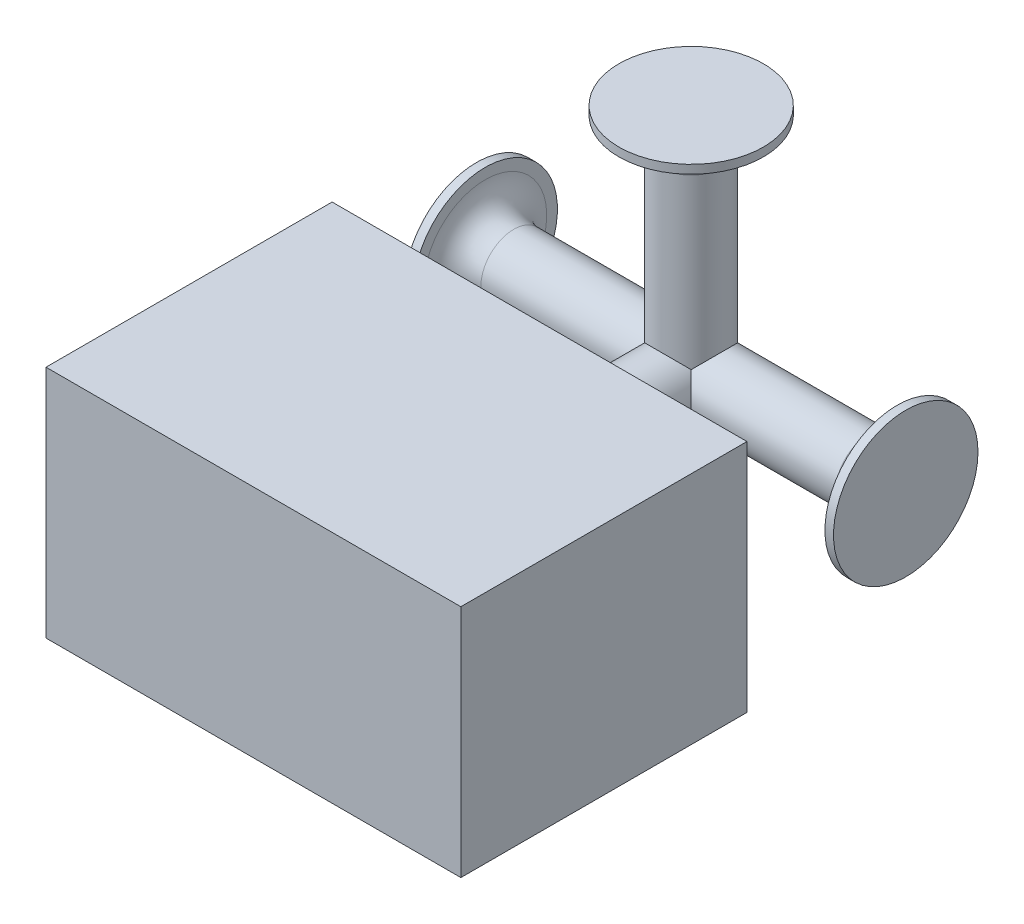
ISO-10303-21;
HEADER;
FILE_DESCRIPTION(('STEP AP214'),'2;1');
FILE_NAME('part.step','',(''),(''),'','','');
FILE_SCHEMA(('AUTOMOTIVE_DESIGN { 1 0 10303 214 1 1 1 1 }'));
ENDSEC;
DATA;
#1=APPLICATION_CONTEXT('core data for automotive mechanical design processes');
#2=APPLICATION_PROTOCOL_DEFINITION('international standard','automotive_design',2000,#1);
#3=PRODUCT_CONTEXT('',#1,'mechanical');
#4=PRODUCT('Part','Part','',(#3));
#5=PRODUCT_RELATED_PRODUCT_CATEGORY('part','',(#4));
#6=PRODUCT_DEFINITION_FORMATION('','',#4);
#7=PRODUCT_DEFINITION_CONTEXT('part definition',#1,'design');
#8=PRODUCT_DEFINITION('design','',#6,#7);
#9=PRODUCT_DEFINITION_SHAPE('','',#8);
#10=(LENGTH_UNIT() NAMED_UNIT(*) SI_UNIT(.MILLI.,.METRE.));
#11=(NAMED_UNIT(*) PLANE_ANGLE_UNIT() SI_UNIT($,.RADIAN.));
#12=(NAMED_UNIT(*) SI_UNIT($,.STERADIAN.) SOLID_ANGLE_UNIT());
#13=UNCERTAINTY_MEASURE_WITH_UNIT(LENGTH_MEASURE(1.E-05),#10,'distance_accuracy_value','');
#14=(GEOMETRIC_REPRESENTATION_CONTEXT(3) GLOBAL_UNCERTAINTY_ASSIGNED_CONTEXT((#13)) GLOBAL_UNIT_ASSIGNED_CONTEXT((#10,
#11,#12)) REPRESENTATION_CONTEXT('',''));
#15=CARTESIAN_POINT('',(0.,0.,0.));
#16=DIRECTION('',(0.,0.,1.));
#17=DIRECTION('',(1.,0.,0.));
#18=AXIS2_PLACEMENT_3D('',#15,#16,#17);
#19=CARTESIAN_POINT('',(0.,-80.,0.));
#20=DIRECTION('',(0.,1.,0.));
#21=DIRECTION('',(0.,0.,1.));
#22=AXIS2_PLACEMENT_3D('',#19,#20,#21);
#23=CYLINDRICAL_SURFACE('',#22,11.5);
#24=CARTESIAN_POINT('',(0.,-13.,0.));
#25=DIRECTION('',(0.,1.,0.));
#26=DIRECTION('',(0.,0.,1.));
#27=AXIS2_PLACEMENT_3D('',#24,#25,#26);
#28=CIRCLE('',#27,11.5);
#29=CARTESIAN_POINT('',(0.,-13.,11.5));
#30=VERTEX_POINT('',#29);
#31=EDGE_CURVE('E147',#30,#30,#28,.F.);
#32=ORIENTED_EDGE('',*,*,#31,.T.);
#33=EDGE_LOOP('',(#32));
#34=FACE_BOUND('',#33,.T.);
#35=CARTESIAN_POINT('',(0.,-80.,0.));
#36=DIRECTION('',(0.,0.707106781186547,-0.707106781186547));
#37=DIRECTION('',(0.,0.707106781186547,0.707106781186547));
#38=AXIS2_PLACEMENT_3D('',#35,#36,#37);
#39=ELLIPSE('',#38,16.2634559672906,11.5);
#40=CARTESIAN_POINT('',(8.13172798364529,-71.8682720163547,8.13172798364529));
#41=VERTEX_POINT('',#40);
#42=CARTESIAN_POINT('',(-8.13172798364529,-71.8682720163547,8.13172798364529));
#43=VERTEX_POINT('',#42);
#44=EDGE_CURVE('E108',#41,#43,#39,.F.);
#45=ORIENTED_EDGE('',*,*,#44,.F.);
#46=CARTESIAN_POINT('',(0.,-80.,0.));
#47=DIRECTION('',(-0.707106781186547,0.707106781186547,0.));
#48=DIRECTION('',(0.707106781186547,0.707106781186547,0.));
#49=AXIS2_PLACEMENT_3D('',#46,#47,#48);
#50=ELLIPSE('',#49,16.2634559672906,11.5);
#51=CARTESIAN_POINT('',(0.,-80.,-11.5));
#52=VERTEX_POINT('',#51);
#53=EDGE_CURVE('E130',#52,#41,#50,.F.);
#54=ORIENTED_EDGE('',*,*,#53,.F.);
#55=CARTESIAN_POINT('',(0.,-80.,0.));
#56=DIRECTION('',(0.707106781186547,0.707106781186547,0.));
#57=DIRECTION('',(-0.707106781186547,0.707106781186547,0.));
#58=AXIS2_PLACEMENT_3D('',#55,#56,#57);
#59=ELLIPSE('',#58,16.2634559672906,11.5);
#60=EDGE_CURVE('E126',#43,#52,#59,.F.);
#61=ORIENTED_EDGE('',*,*,#60,.F.);
#62=EDGE_LOOP('',(#45,#54,#61));
#63=FACE_BOUND('',#62,.T.);
#64=ADVANCED_FACE('F32',(#34,#63),#23,.T.);
#65=CARTESIAN_POINT('',(72.,-80.,0.));
#66=DIRECTION('',(-1.,0.,0.));
#67=DIRECTION('',(0.,0.,1.));
#68=AXIS2_PLACEMENT_3D('',#65,#66,#67);
#69=CYLINDRICAL_SURFACE('',#68,11.5);
#70=CARTESIAN_POINT('',(62.,-80.,0.));
#71=DIRECTION('',(1.,0.,0.));
#72=DIRECTION('',(0.,0.,-1.));
#73=AXIS2_PLACEMENT_3D('',#70,#71,#72);
#74=CIRCLE('',#73,11.5);
#75=CARTESIAN_POINT('',(62.,-80.,-11.5));
#76=VERTEX_POINT('',#75);
#77=EDGE_CURVE('E136',#76,#76,#74,.F.);
#78=ORIENTED_EDGE('',*,*,#77,.T.);
#79=EDGE_LOOP('',(#78));
#80=FACE_BOUND('',#79,.T.);
#81=CARTESIAN_POINT('',(-62.,-80.,0.));
#82=DIRECTION('',(-1.,0.,0.));
#83=DIRECTION('',(0.,0.,1.));
#84=AXIS2_PLACEMENT_3D('',#81,#82,#83);
#85=CIRCLE('',#84,11.5);
#86=CARTESIAN_POINT('',(-62.,-80.,11.5));
#87=VERTEX_POINT('',#86);
#88=EDGE_CURVE('E141',#87,#87,#85,.F.);
#89=ORIENTED_EDGE('',*,*,#88,.T.);
#90=EDGE_LOOP('',(#89));
#91=FACE_BOUND('',#90,.T.);
#92=CARTESIAN_POINT('',(0.,-80.,0.));
#93=DIRECTION('',(-0.707106781186547,0.,-0.707106781186547));
#94=DIRECTION('',(-0.707106781186547,0.,0.707106781186547));
#95=AXIS2_PLACEMENT_3D('',#92,#93,#94);
#96=ELLIPSE('',#95,16.2634559672906,11.5);
#97=CARTESIAN_POINT('',(0.,-91.5,0.));
#98=VERTEX_POINT('',#97);
#99=EDGE_CURVE('E11',#43,#98,#96,.F.);
#100=ORIENTED_EDGE('',*,*,#99,.F.);
#101=ORIENTED_EDGE('',*,*,#60,.T.);
#102=ORIENTED_EDGE('',*,*,#53,.T.);
#103=CARTESIAN_POINT('',(0.,-80.,0.));
#104=DIRECTION('',(-0.707106781186547,0.,0.707106781186547));
#105=DIRECTION('',(-0.707106781186547,0.,-0.707106781186547));
#106=AXIS2_PLACEMENT_3D('',#103,#104,#105);
#107=ELLIPSE('',#106,16.2634559672906,11.5);
#108=EDGE_CURVE('E40',#98,#41,#107,.T.);
#109=ORIENTED_EDGE('',*,*,#108,.F.);
#110=EDGE_LOOP('',(#100,#101,#102,#109));
#111=FACE_BOUND('',#110,.T.);
#112=ADVANCED_FACE('F160',(#80,#91,#111),#69,.T.);
#113=CARTESIAN_POINT('',(0.,-3.,0.));
#114=DIRECTION('',(0.,1.,0.));
#115=DIRECTION('',(0.,0.,1.));
#116=AXIS2_PLACEMENT_3D('',#113,#114,#115);
#117=CYLINDRICAL_SURFACE('',#116,25.25);
#118=CARTESIAN_POINT('',(0.,-3.,0.));
#119=DIRECTION('',(0.,1.,0.));
#120=DIRECTION('',(0.,0.,1.));
#121=AXIS2_PLACEMENT_3D('',#118,#119,#120);
#122=CIRCLE('',#121,25.25);
#123=CARTESIAN_POINT('',(0.,-3.,25.25));
#124=VERTEX_POINT('',#123);
#125=EDGE_CURVE('E133',#124,#124,#122,.T.);
#126=ORIENTED_EDGE('',*,*,#125,.T.);
#127=EDGE_LOOP('',(#126));
#128=FACE_BOUND('',#127,.T.);
#129=CARTESIAN_POINT('',(0.,0.,0.));
#130=DIRECTION('',(0.,1.,0.));
#131=DIRECTION('',(0.,0.,1.));
#132=AXIS2_PLACEMENT_3D('',#129,#130,#131);
#133=CIRCLE('',#132,25.25);
#134=CARTESIAN_POINT('',(0.,0.,25.25));
#135=VERTEX_POINT('',#134);
#136=EDGE_CURVE('E132',#135,#135,#133,.T.);
#137=ORIENTED_EDGE('',*,*,#136,.F.);
#138=EDGE_LOOP('',(#137));
#139=FACE_BOUND('',#138,.T.);
#140=ADVANCED_FACE('F162',(#128,#139),#117,.T.);
#141=CARTESIAN_POINT('',(0.,-3.,0.));
#142=DIRECTION('',(0.,1.,0.));
#143=DIRECTION('',(0.,0.,1.));
#144=AXIS2_PLACEMENT_3D('',#141,#142,#143);
#145=PLANE('',#144);
#146=CARTESIAN_POINT('',(0.,-3.,0.));
#147=DIRECTION('',(0.,1.,0.));
#148=DIRECTION('',(0.,0.,1.));
#149=AXIS2_PLACEMENT_3D('',#146,#147,#148);
#150=CIRCLE('',#149,21.5);
#151=CARTESIAN_POINT('',(0.,-3.,21.5));
#152=VERTEX_POINT('',#151);
#153=EDGE_CURVE('E150',#152,#152,#150,.T.);
#154=ORIENTED_EDGE('',*,*,#153,.T.);
#155=EDGE_LOOP('',(#154));
#156=FACE_BOUND('',#155,.T.);
#157=ORIENTED_EDGE('',*,*,#125,.F.);
#158=EDGE_LOOP('',(#157));
#159=FACE_BOUND('',#158,.T.);
#160=ADVANCED_FACE('F169',(#156,#159),#145,.F.);
#161=CARTESIAN_POINT('',(0.,0.,0.));
#162=DIRECTION('',(0.,1.,0.));
#163=DIRECTION('',(0.,0.,1.));
#164=AXIS2_PLACEMENT_3D('',#161,#162,#163);
#165=PLANE('',#164);
#166=ORIENTED_EDGE('',*,*,#136,.T.);
#167=EDGE_LOOP('',(#166));
#168=FACE_BOUND('',#167,.T.);
#169=ADVANCED_FACE('F181',(#168),#165,.T.);
#170=CARTESIAN_POINT('',(75.,-80.,0.));
#171=DIRECTION('',(-1.,0.,0.));
#172=DIRECTION('',(0.,0.,1.));
#173=AXIS2_PLACEMENT_3D('',#170,#171,#172);
#174=CYLINDRICAL_SURFACE('',#173,25.25);
#175=CARTESIAN_POINT('',(75.,-80.,0.));
#176=DIRECTION('',(1.,0.,0.));
#177=DIRECTION('',(0.,0.,-1.));
#178=AXIS2_PLACEMENT_3D('',#175,#176,#177);
#179=CIRCLE('',#178,25.25);
#180=CARTESIAN_POINT('',(75.,-80.,-25.25));
#181=VERTEX_POINT('',#180);
#182=EDGE_CURVE('E123',#181,#181,#179,.T.);
#183=ORIENTED_EDGE('',*,*,#182,.F.);
#184=EDGE_LOOP('',(#183));
#185=FACE_BOUND('',#184,.T.);
#186=CARTESIAN_POINT('',(72.,-80.,0.));
#187=DIRECTION('',(1.,0.,0.));
#188=DIRECTION('',(0.,0.,-1.));
#189=AXIS2_PLACEMENT_3D('',#186,#187,#188);
#190=CIRCLE('',#189,25.25);
#191=CARTESIAN_POINT('',(72.,-80.,-25.25));
#192=VERTEX_POINT('',#191);
#193=EDGE_CURVE('E120',#192,#192,#190,.T.);
#194=ORIENTED_EDGE('',*,*,#193,.T.);
#195=EDGE_LOOP('',(#194));
#196=FACE_BOUND('',#195,.T.);
#197=ADVANCED_FACE('F176',(#185,#196),#174,.T.);
#198=CARTESIAN_POINT('',(75.,-80.,0.));
#199=DIRECTION('',(1.,0.,0.));
#200=DIRECTION('',(0.,0.,-1.));
#201=AXIS2_PLACEMENT_3D('',#198,#199,#200);
#202=PLANE('',#201);
#203=ORIENTED_EDGE('',*,*,#182,.T.);
#204=EDGE_LOOP('',(#203));
#205=FACE_BOUND('',#204,.T.);
#206=ADVANCED_FACE('F217',(#205),#202,.T.);
#207=CARTESIAN_POINT('',(72.,-80.,0.));
#208=DIRECTION('',(1.,0.,0.));
#209=DIRECTION('',(0.,0.,-1.));
#210=AXIS2_PLACEMENT_3D('',#207,#208,#209);
#211=PLANE('',#210);
#212=CARTESIAN_POINT('',(72.,-80.,0.));
#213=DIRECTION('',(1.,0.,0.));
#214=DIRECTION('',(0.,0.,-1.));
#215=AXIS2_PLACEMENT_3D('',#212,#213,#214);
#216=CIRCLE('',#215,21.5);
#217=CARTESIAN_POINT('',(72.,-80.,-21.5));
#218=VERTEX_POINT('',#217);
#219=EDGE_CURVE('E153',#218,#218,#216,.T.);
#220=ORIENTED_EDGE('',*,*,#219,.T.);
#221=EDGE_LOOP('',(#220));
#222=FACE_BOUND('',#221,.T.);
#223=ORIENTED_EDGE('',*,*,#193,.F.);
#224=EDGE_LOOP('',(#223));
#225=FACE_BOUND('',#224,.T.);
#226=ADVANCED_FACE('F213',(#222,#225),#211,.F.);
#227=CARTESIAN_POINT('',(-75.,-80.,0.));
#228=DIRECTION('',(1.,0.,0.));
#229=DIRECTION('',(0.,0.,-1.));
#230=AXIS2_PLACEMENT_3D('',#227,#228,#229);
#231=CYLINDRICAL_SURFACE('',#230,25.25);
#232=CARTESIAN_POINT('',(-75.,-80.,0.));
#233=DIRECTION('',(-1.,0.,0.));
#234=DIRECTION('',(0.,0.,1.));
#235=AXIS2_PLACEMENT_3D('',#232,#233,#234);
#236=CIRCLE('',#235,25.25);
#237=CARTESIAN_POINT('',(-75.,-80.,25.25));
#238=VERTEX_POINT('',#237);
#239=EDGE_CURVE('E117',#238,#238,#236,.T.);
#240=ORIENTED_EDGE('',*,*,#239,.F.);
#241=EDGE_LOOP('',(#240));
#242=FACE_BOUND('',#241,.T.);
#243=CARTESIAN_POINT('',(-72.,-80.,0.));
#244=DIRECTION('',(-1.,0.,0.));
#245=DIRECTION('',(0.,0.,1.));
#246=AXIS2_PLACEMENT_3D('',#243,#244,#245);
#247=CIRCLE('',#246,25.25);
#248=CARTESIAN_POINT('',(-72.,-80.,25.25));
#249=VERTEX_POINT('',#248);
#250=EDGE_CURVE('E116',#249,#249,#247,.T.);
#251=ORIENTED_EDGE('',*,*,#250,.T.);
#252=EDGE_LOOP('',(#251));
#253=FACE_BOUND('',#252,.T.);
#254=ADVANCED_FACE('F216',(#242,#253),#231,.T.);
#255=CARTESIAN_POINT('',(-75.,-80.,0.));
#256=DIRECTION('',(-1.,0.,0.));
#257=DIRECTION('',(0.,0.,1.));
#258=AXIS2_PLACEMENT_3D('',#255,#256,#257);
#259=PLANE('',#258);
#260=ORIENTED_EDGE('',*,*,#239,.T.);
#261=EDGE_LOOP('',(#260));
#262=FACE_BOUND('',#261,.T.);
#263=ADVANCED_FACE('F233',(#262),#259,.T.);
#264=CARTESIAN_POINT('',(-72.,-80.,0.));
#265=DIRECTION('',(-1.,0.,0.));
#266=DIRECTION('',(0.,0.,1.));
#267=AXIS2_PLACEMENT_3D('',#264,#265,#266);
#268=PLANE('',#267);
#269=CARTESIAN_POINT('',(-72.,-80.,0.));
#270=DIRECTION('',(-1.,0.,0.));
#271=DIRECTION('',(0.,0.,1.));
#272=AXIS2_PLACEMENT_3D('',#269,#270,#271);
#273=CIRCLE('',#272,21.5);
#274=CARTESIAN_POINT('',(-72.,-80.,21.5));
#275=VERTEX_POINT('',#274);
#276=EDGE_CURVE('E144',#275,#275,#273,.T.);
#277=ORIENTED_EDGE('',*,*,#276,.T.);
#278=EDGE_LOOP('',(#277));
#279=FACE_BOUND('',#278,.T.);
#280=ORIENTED_EDGE('',*,*,#250,.F.);
#281=EDGE_LOOP('',(#280));
#282=FACE_BOUND('',#281,.T.);
#283=ADVANCED_FACE('F189',(#279,#282),#268,.F.);
#284=CARTESIAN_POINT('',(-62.,-80.,0.));
#285=DIRECTION('',(-1.,0.,0.));
#286=DIRECTION('',(0.,0.,1.));
#287=AXIS2_PLACEMENT_3D('',#284,#285,#286);
#288=TOROIDAL_SURFACE('',#287,21.5,10.);
#289=ORIENTED_EDGE('',*,*,#276,.F.);
#290=EDGE_LOOP('',(#289));
#291=FACE_BOUND('',#290,.T.);
#292=ORIENTED_EDGE('',*,*,#88,.F.);
#293=EDGE_LOOP('',(#292));
#294=FACE_BOUND('',#293,.T.);
#295=ADVANCED_FACE('F186',(#291,#294),#288,.F.);
#296=CARTESIAN_POINT('',(0.,-13.,0.));
#297=DIRECTION('',(0.,1.,0.));
#298=DIRECTION('',(0.,0.,1.));
#299=AXIS2_PLACEMENT_3D('',#296,#297,#298);
#300=TOROIDAL_SURFACE('',#299,21.5,10.);
#301=ORIENTED_EDGE('',*,*,#153,.F.);
#302=EDGE_LOOP('',(#301));
#303=FACE_BOUND('',#302,.T.);
#304=ORIENTED_EDGE('',*,*,#31,.F.);
#305=EDGE_LOOP('',(#304));
#306=FACE_BOUND('',#305,.T.);
#307=ADVANCED_FACE('F188',(#303,#306),#300,.F.);
#308=CARTESIAN_POINT('',(62.,-80.,0.));
#309=DIRECTION('',(1.,0.,0.));
#310=DIRECTION('',(0.,0.,-1.));
#311=AXIS2_PLACEMENT_3D('',#308,#309,#310);
#312=TOROIDAL_SURFACE('',#311,21.5,10.);
#313=ORIENTED_EDGE('',*,*,#77,.F.);
#314=EDGE_LOOP('',(#313));
#315=FACE_BOUND('',#314,.T.);
#316=ORIENTED_EDGE('',*,*,#219,.F.);
#317=EDGE_LOOP('',(#316));
#318=FACE_BOUND('',#317,.T.);
#319=ADVANCED_FACE('F34',(#315,#318),#312,.F.);
#320=CARTESIAN_POINT('',(0.,-80.,53.));
#321=DIRECTION('',(0.,0.,-1.));
#322=DIRECTION('',(-1.,0.,0.));
#323=AXIS2_PLACEMENT_3D('',#320,#321,#322);
#324=CYLINDRICAL_SURFACE('',#323,11.5);
#325=CARTESIAN_POINT('',(0.,-80.,53.));
#326=DIRECTION('',(0.,0.,1.));
#327=DIRECTION('',(1.,0.,0.));
#328=AXIS2_PLACEMENT_3D('',#325,#326,#327);
#329=CIRCLE('',#328,11.5);
#330=CARTESIAN_POINT('',(11.5,-80.,53.));
#331=VERTEX_POINT('',#330);
#332=EDGE_CURVE('E105',#331,#331,#329,.T.);
#333=ORIENTED_EDGE('',*,*,#332,.F.);
#334=EDGE_LOOP('',(#333));
#335=FACE_BOUND('',#334,.T.);
#336=ORIENTED_EDGE('',*,*,#108,.T.);
#337=ORIENTED_EDGE('',*,*,#44,.T.);
#338=ORIENTED_EDGE('',*,*,#99,.T.);
#339=EDGE_LOOP('',(#336,#337,#338));
#340=FACE_BOUND('',#339,.T.);
#341=ADVANCED_FACE('F156',(#335,#340),#324,.T.);
#342=CARTESIAN_POINT('',(72.5,-39.,153.));
#343=DIRECTION('',(-1.,0.,0.));
#344=DIRECTION('',(0.,0.,1.));
#345=AXIS2_PLACEMENT_3D('',#342,#343,#344);
#346=PLANE('',#345);
#347=DIRECTION('',(0.,0.,-1.));
#348=VECTOR('',#347,1.);
#349=CARTESIAN_POINT('',(72.5,-121.,153.));
#350=LINE('',#349,#348);
#351=CARTESIAN_POINT('',(72.5,-121.,153.));
#352=VERTEX_POINT('',#351);
#353=CARTESIAN_POINT('',(72.5,-121.,53.));
#354=VERTEX_POINT('',#353);
#355=EDGE_CURVE('E104',#352,#354,#350,.T.);
#356=ORIENTED_EDGE('',*,*,#355,.T.);
#357=DIRECTION('',(0.,-1.,0.));
#358=VECTOR('',#357,1.);
#359=CARTESIAN_POINT('',(72.5,-39.,53.));
#360=LINE('',#359,#358);
#361=CARTESIAN_POINT('',(72.5,-39.,53.));
#362=VERTEX_POINT('',#361);
#363=EDGE_CURVE('E84',#362,#354,#360,.T.);
#364=ORIENTED_EDGE('',*,*,#363,.F.);
#365=DIRECTION('',(0.,0.,-1.));
#366=VECTOR('',#365,1.);
#367=CARTESIAN_POINT('',(72.5,-39.,153.));
#368=LINE('',#367,#366);
#369=CARTESIAN_POINT('',(72.5,-39.,153.));
#370=VERTEX_POINT('',#369);
#371=EDGE_CURVE('E91',#370,#362,#368,.T.);
#372=ORIENTED_EDGE('',*,*,#371,.F.);
#373=DIRECTION('',(0.,-1.,0.));
#374=VECTOR('',#373,1.);
#375=CARTESIAN_POINT('',(72.5,-39.,153.));
#376=LINE('',#375,#374);
#377=EDGE_CURVE('E386',#370,#352,#376,.T.);
#378=ORIENTED_EDGE('',*,*,#377,.T.);
#379=EDGE_LOOP('',(#356,#364,#372,#378));
#380=FACE_BOUND('',#379,.T.);
#381=ADVANCED_FACE('F102',(#380),#346,.F.);
#382=CARTESIAN_POINT('',(-72.5,-39.,53.));
#383=DIRECTION('',(0.,0.,1.));
#384=DIRECTION('',(1.,0.,0.));
#385=AXIS2_PLACEMENT_3D('',#382,#383,#384);
#386=PLANE('',#385);
#387=ORIENTED_EDGE('',*,*,#332,.T.);
#388=EDGE_LOOP('',(#387));
#389=FACE_BOUND('',#388,.T.);
#390=DIRECTION('',(-1.,0.,0.));
#391=VECTOR('',#390,1.);
#392=CARTESIAN_POINT('',(-72.5,-121.,53.));
#393=LINE('',#392,#391);
#394=CARTESIAN_POINT('',(-72.5,-121.,53.));
#395=VERTEX_POINT('',#394);
#396=EDGE_CURVE('E377',#354,#395,#393,.T.);
#397=ORIENTED_EDGE('',*,*,#396,.T.);
#398=DIRECTION('',(0.,-1.,0.));
#399=VECTOR('',#398,1.);
#400=CARTESIAN_POINT('',(-72.5,-39.,53.));
#401=LINE('',#400,#399);
#402=CARTESIAN_POINT('',(-72.5,-39.,53.));
#403=VERTEX_POINT('',#402);
#404=EDGE_CURVE('E87',#403,#395,#401,.T.);
#405=ORIENTED_EDGE('',*,*,#404,.F.);
#406=DIRECTION('',(-1.,0.,0.));
#407=VECTOR('',#406,1.);
#408=CARTESIAN_POINT('',(-72.5,-39.,53.));
#409=LINE('',#408,#407);
#410=EDGE_CURVE('E80',#362,#403,#409,.T.);
#411=ORIENTED_EDGE('',*,*,#410,.F.);
#412=ORIENTED_EDGE('',*,*,#363,.T.);
#413=EDGE_LOOP('',(#397,#405,#411,#412));
#414=FACE_BOUND('',#413,.T.);
#415=ADVANCED_FACE('F82',(#389,#414),#386,.F.);
#416=CARTESIAN_POINT('',(-72.5,-39.,153.));
#417=DIRECTION('',(1.,0.,0.));
#418=DIRECTION('',(0.,0.,-1.));
#419=AXIS2_PLACEMENT_3D('',#416,#417,#418);
#420=PLANE('',#419);
#421=DIRECTION('',(0.,0.,1.));
#422=VECTOR('',#421,1.);
#423=CARTESIAN_POINT('',(-72.5,-121.,153.));
#424=LINE('',#423,#422);
#425=CARTESIAN_POINT('',(-72.5,-121.,153.));
#426=VERTEX_POINT('',#425);
#427=EDGE_CURVE('E379',#395,#426,#424,.T.);
#428=ORIENTED_EDGE('',*,*,#427,.T.);
#429=DIRECTION('',(0.,-1.,0.));
#430=VECTOR('',#429,1.);
#431=CARTESIAN_POINT('',(-72.5,-39.,153.));
#432=LINE('',#431,#430);
#433=CARTESIAN_POINT('',(-72.5,-39.,153.));
#434=VERTEX_POINT('',#433);
#435=EDGE_CURVE('E110',#434,#426,#432,.T.);
#436=ORIENTED_EDGE('',*,*,#435,.F.);
#437=DIRECTION('',(0.,0.,1.));
#438=VECTOR('',#437,1.);
#439=CARTESIAN_POINT('',(-72.5,-39.,153.));
#440=LINE('',#439,#438);
#441=EDGE_CURVE('E90',#403,#434,#440,.T.);
#442=ORIENTED_EDGE('',*,*,#441,.F.);
#443=ORIENTED_EDGE('',*,*,#404,.T.);
#444=EDGE_LOOP('',(#428,#436,#442,#443));
#445=FACE_BOUND('',#444,.T.);
#446=ADVANCED_FACE('F245',(#445),#420,.F.);
#447=CARTESIAN_POINT('',(-72.5,-39.,153.));
#448=DIRECTION('',(0.,0.,-1.));
#449=DIRECTION('',(-1.,0.,0.));
#450=AXIS2_PLACEMENT_3D('',#447,#448,#449);
#451=PLANE('',#450);
#452=DIRECTION('',(1.,0.,0.));
#453=VECTOR('',#452,1.);
#454=CARTESIAN_POINT('',(-72.5,-121.,153.));
#455=LINE('',#454,#453);
#456=EDGE_CURVE('E100',#426,#352,#455,.T.);
#457=ORIENTED_EDGE('',*,*,#456,.T.);
#458=ORIENTED_EDGE('',*,*,#377,.F.);
#459=DIRECTION('',(1.,0.,0.));
#460=VECTOR('',#459,1.);
#461=CARTESIAN_POINT('',(-72.5,-39.,153.));
#462=LINE('',#461,#460);
#463=EDGE_CURVE('E96',#434,#370,#462,.T.);
#464=ORIENTED_EDGE('',*,*,#463,.F.);
#465=ORIENTED_EDGE('',*,*,#435,.T.);
#466=EDGE_LOOP('',(#457,#458,#464,#465));
#467=FACE_BOUND('',#466,.T.);
#468=ADVANCED_FACE('F249',(#467),#451,.F.);
#469=CARTESIAN_POINT('',(0.,-39.,0.));
#470=DIRECTION('',(0.,-1.,0.));
#471=DIRECTION('',(0.,0.,-1.));
#472=AXIS2_PLACEMENT_3D('',#469,#470,#471);
#473=PLANE('',#472);
#474=ORIENTED_EDGE('',*,*,#371,.T.);
#475=ORIENTED_EDGE('',*,*,#410,.T.);
#476=ORIENTED_EDGE('',*,*,#441,.T.);
#477=ORIENTED_EDGE('',*,*,#463,.T.);
#478=EDGE_LOOP('',(#474,#475,#476,#477));
#479=FACE_BOUND('',#478,.T.);
#480=ADVANCED_FACE('F94',(#479),#473,.F.);
#481=CARTESIAN_POINT('',(0.,-121.,0.));
#482=DIRECTION('',(0.,-1.,0.));
#483=DIRECTION('',(0.,0.,-1.));
#484=AXIS2_PLACEMENT_3D('',#481,#482,#483);
#485=PLANE('',#484);
#486=ORIENTED_EDGE('',*,*,#355,.F.);
#487=ORIENTED_EDGE('',*,*,#456,.F.);
#488=ORIENTED_EDGE('',*,*,#427,.F.);
#489=ORIENTED_EDGE('',*,*,#396,.F.);
#490=EDGE_LOOP('',(#486,#487,#488,#489));
#491=FACE_BOUND('',#490,.T.);
#492=ADVANCED_FACE('F254',(#491),#485,.T.);
#493=CLOSED_SHELL('',(#64,#112,#140,#160,#169,#197,#206,#226,#254,#263,#283,#295,#307,#319,#341,
#381,#415,#446,#468,#480,#492));
#494=MANIFOLD_SOLID_BREP('B2',#493);
#495=ADVANCED_BREP_SHAPE_REPRESENTATION('',(#18,#494),#14);
#496=SHAPE_DEFINITION_REPRESENTATION(#9,#495);
ENDSEC;
END-ISO-10303-21;
